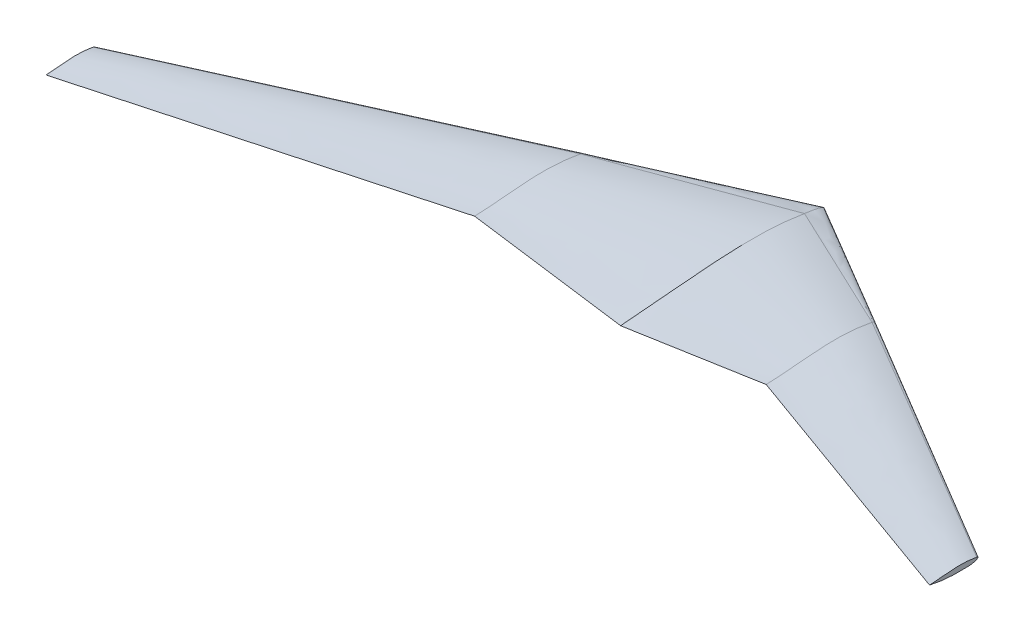
ISO-10303-21;
HEADER;
FILE_DESCRIPTION(('STEP AP214'),'2;1');
FILE_NAME('part.step','',(''),(''),'','','');
FILE_SCHEMA(('AUTOMOTIVE_DESIGN { 1 0 10303 214 1 1 1 1 }'));
ENDSEC;
DATA;
#1=APPLICATION_CONTEXT('core data for automotive mechanical design processes');
#2=APPLICATION_PROTOCOL_DEFINITION('international standard','automotive_design',2000,#1);
#3=PRODUCT_CONTEXT('',#1,'mechanical');
#4=PRODUCT('Part','Part','',(#3));
#5=PRODUCT_RELATED_PRODUCT_CATEGORY('part','',(#4));
#6=PRODUCT_DEFINITION_FORMATION('','',#4);
#7=PRODUCT_DEFINITION_CONTEXT('part definition',#1,'design');
#8=PRODUCT_DEFINITION('design','',#6,#7);
#9=PRODUCT_DEFINITION_SHAPE('','',#8);
#10=(LENGTH_UNIT() NAMED_UNIT(*) SI_UNIT(.MILLI.,.METRE.));
#11=(NAMED_UNIT(*) PLANE_ANGLE_UNIT() SI_UNIT($,.RADIAN.));
#12=(NAMED_UNIT(*) SI_UNIT($,.STERADIAN.) SOLID_ANGLE_UNIT());
#13=UNCERTAINTY_MEASURE_WITH_UNIT(LENGTH_MEASURE(1.E-05),#10,'distance_accuracy_value','');
#14=(GEOMETRIC_REPRESENTATION_CONTEXT(3) GLOBAL_UNCERTAINTY_ASSIGNED_CONTEXT((#13)) GLOBAL_UNIT_ASSIGNED_CONTEXT((#10,
#11,#12)) REPRESENTATION_CONTEXT('',''));
#15=CARTESIAN_POINT('',(0.,0.,0.));
#16=DIRECTION('',(0.,0.,1.));
#17=DIRECTION('',(1.,0.,0.));
#18=AXIS2_PLACEMENT_3D('',#15,#16,#17);
#19=CARTESIAN_POINT('',(0.,260.387336810801,-744.733559914351));
#20=CARTESIAN_POINT('',(-7292.34,1153.17328324079,3166.45384113986));
#21=CARTESIAN_POINT('',(0.,217.676560237623,-941.669375822272));
#22=CARTESIAN_POINT('',(-7292.34,1151.52912943844,3129.42071627404));
#23=CARTESIAN_POINT('',(0.,200.985498169548,-1201.06351893948));
#24=CARTESIAN_POINT('',(-7292.34,1139.46120575545,3087.83128190049));
#25=CARTESIAN_POINT('',(0.,135.060922071614,-1483.36610378253));
#26=CARTESIAN_POINT('',(-7292.34,1111.81578521799,3050.76264197452));
#27=CARTESIAN_POINT('',(0.,85.2767654545005,-1618.65012495777));
#28=CARTESIAN_POINT('',(-7292.34,1095.45851871228,3033.60396087625));
#29=CARTESIAN_POINT('',(0.,59.3682520834628,-1706.22020449412));
#30=CARTESIAN_POINT('',(-7292.34,1084.31703089921,3024.30886069101));
#31=CARTESIAN_POINT('',(0.,0.,-1731.48199233716));
#32=CARTESIAN_POINT('',(-7292.34,1076.1900662028,3018.47092959704));
#33=B_SPLINE_SURFACE_WITH_KNOTS('',3,1,((#19,#20),(#21,#22),(#23,#24),(#25,#26),(#27,#28),(#29,
#30),(#31,#32)),.UNSPECIFIED.,.F.,.F.,.F.,(4,1,1,1,4),(2,2),(0.,0.580238622590455,
0.750540673183221,0.832394192156572,1.),(0.,1.),.UNSPECIFIED.);
#34=CARTESIAN_POINT('',(0.,0.,-1731.48199233716));
#35=CARTESIAN_POINT('',(0.,59.3682520834628,-1706.22020449412));
#36=CARTESIAN_POINT('',(0.,85.2767654545005,-1618.65012495777));
#37=CARTESIAN_POINT('',(0.,135.060922071614,-1483.36610378253));
#38=CARTESIAN_POINT('',(0.,200.985498169548,-1201.06351893948));
#39=CARTESIAN_POINT('',(0.,217.676560237623,-941.669375822272));
#40=CARTESIAN_POINT('',(0.,260.387336810801,-744.733559914351));
#41=B_SPLINE_CURVE_WITH_KNOTS('',3,(#34,#35,#36,#37,#38,#39,#40),.UNSPECIFIED.,.F.,.F.,(4,1,1,1,
4),(0.,0.167605807843428,0.249459326816779,0.419761377409545,1.),.UNSPECIFIED.);
#42=CARTESIAN_POINT('',(0.,0.,-1731.48199233716));
#43=VERTEX_POINT('',#42);
#44=CARTESIAN_POINT('',(0.,260.387336810801,-744.733559914351));
#45=VERTEX_POINT('',#44);
#46=EDGE_CURVE('E136',#43,#45,#41,.T.);
#47=DIRECTION('',(-0.831587756276085,0.12272418489541,0.541664636148109));
#48=VECTOR('',#47,1.);
#49=CARTESIAN_POINT('',(-3646.17,538.095033101399,643.49446862994));
#50=LINE('',#49,#48);
#51=CARTESIAN_POINT('',(-7292.34,1076.1900662028,3018.47092959704));
#52=VERTEX_POINT('',#51);
#53=EDGE_CURVE('E404',#43,#52,#50,.T.);
#54=CARTESIAN_POINT('',(-7292.34,1076.1900662028,3018.47092959704));
#55=CARTESIAN_POINT('',(-7292.34,1148.92291001933,3070.71790572293));
#56=CARTESIAN_POINT('',(-7292.34,1153.17328324079,3166.45384113986));
#57=B_SPLINE_CURVE_WITH_KNOTS('',2,(#54,#55,#56),.UNSPECIFIED.,.F.,.F.,(3,3),(0.,1.),.UNSPECIFIED.);
#58=CARTESIAN_POINT('',(-7292.34,1153.17328324079,3166.45384113986));
#59=VERTEX_POINT('',#58);
#60=EDGE_CURVE('E12',#52,#59,#57,.T.);
#61=DIRECTION('',(0.876165050992659,-0.107267056154727,-0.469924017350604));
#62=VECTOR('',#61,1.);
#63=CARTESIAN_POINT('',(-3646.17,706.780310025795,1210.86014061275));
#64=LINE('',#63,#62);
#65=EDGE_CURVE('E361',#59,#45,#64,.T.);
#66=ORIENTED_EDGE('',*,*,#46,.F.);
#67=ORIENTED_EDGE('',*,*,#53,.T.);
#68=ORIENTED_EDGE('',*,*,#60,.T.);
#69=ORIENTED_EDGE('',*,*,#65,.T.);
#70=EDGE_LOOP('',(#66,#67,#68,#69));
#71=FACE_BOUND('',#70,.T.);
#72=ADVANCED_FACE('F107',(#71),#33,.T.);
#73=CARTESIAN_POINT('',(0.,0.,-1731.48199233716));
#74=CARTESIAN_POINT('',(-7292.34,1076.1900662028,3018.47092959704));
#75=CARTESIAN_POINT('',(0.,-118.734933461686,-1686.62498270225));
#76=CARTESIAN_POINT('',(-7292.34,1015.35737052522,3043.11370785958));
#77=CARTESIAN_POINT('',(0.,-236.972907199275,-1555.63619789665));
#78=CARTESIAN_POINT('',(-7292.34,955.276697450234,3122.37248310726));
#79=CARTESIAN_POINT('',(0.,-335.876819266343,-1349.99085497511));
#80=CARTESIAN_POINT('',(-7292.34,902.010557440944,3228.31234854547));
#81=CARTESIAN_POINT('',(0.,-469.570111960643,-1018.52456392987));
#82=CARTESIAN_POINT('',(-7292.34,832.095207762413,3401.66546839392));
#83=CARTESIAN_POINT('',(0.,-534.481345840856,-706.781055340202));
#84=CARTESIAN_POINT('',(-7292.34,796.628143439702,3570.28743860462));
#85=CARTESIAN_POINT('',(0.,-608.55645212864,-204.821333547278));
#86=CARTESIAN_POINT('',(-7292.34,757.703773263779,3840.22450337775));
#87=CARTESIAN_POINT('',(0.,-639.819677144706,126.949756489253));
#88=CARTESIAN_POINT('',(-7292.34,741.670424195974,4016.95491271545));
#89=CARTESIAN_POINT('',(0.,-674.201759282268,707.725221686085));
#90=CARTESIAN_POINT('',(-7292.34,724.164355584166,4326.4926402643));
#91=CARTESIAN_POINT('',(0.,-704.852858904594,1719.05710390087));
#92=CARTESIAN_POINT('',(-7292.34,711.225620174203,4867.09050785209));
#93=CARTESIAN_POINT('',(0.,-620.796740378935,4381.28859046797));
#94=CARTESIAN_POINT('',(-7292.34,728.428241013039,6290.67588617311));
#95=CARTESIAN_POINT('',(0.,-408.148490452978,6774.79444878944));
#96=CARTESIAN_POINT('',(-7292.34,884.90141922579,7561.36718461676));
#97=CARTESIAN_POINT('',(0.,0.,8454.54652640662));
#98=CARTESIAN_POINT('',(-7292.34,1103.03602541015,8461.91724150198));
#99=B_SPLINE_SURFACE_WITH_KNOTS('',3,1,((#73,#74),(#75,#76),(#77,#78),(#79,#80),(#81,#82),(#83,
#84),(#85,#86),(#87,#88),(#89,#90),(#91,#92),(#93,#94),(#95,#96),(#97,#98)),.UNSPECIFIED.,.F.,
.F.,.F.,(4,1,1,1,1,1,1,1,1,1,4),(2,2),(0.,0.0348359920457492,0.0508316330037527,
0.063802160185397,0.136254587096267,0.142864047268261,0.210368092571849,0.232210997366321,
0.310372825852521,0.50206229306496,1.),(0.,1.),.UNSPECIFIED.);
#100=CARTESIAN_POINT('',(0.,0.,8454.54652640662));
#101=CARTESIAN_POINT('',(0.,-408.148490452978,6774.79444878944));
#102=CARTESIAN_POINT('',(0.,-644.898134090907,4110.0104254071));
#103=CARTESIAN_POINT('',(0.,-719.990329527877,1115.38515346805));
#104=CARTESIAN_POINT('',(0.,-593.87329251628,-449.105010634986));
#105=CARTESIAN_POINT('',(0.,-422.477503460265,-1234.25075835153));
#106=CARTESIAN_POINT('',(0.,-173.254447713824,-1666.0279915321));
#107=CARTESIAN_POINT('',(0.,0.,-1731.48199233716));
#108=B_SPLINE_CURVE_WITH_KNOTS('',3,(#100,#101,#102,#103,#104,#105,#106,#107),.UNSPECIFIED.,.F.,
.F.,(4,1,1,1,1,4),(0.,0.49793770693504,0.767789002633679,0.863745412903733,0.949168366996247,
1.),.UNSPECIFIED.);
#109=CARTESIAN_POINT('',(0.,0.,8454.54652640662));
#110=VERTEX_POINT('',#109);
#111=EDGE_CURVE('E114',#110,#43,#108,.T.);
#112=DIRECTION('',(-0.98875241302255,0.149558239436873,0.000999379120590447));
#113=VECTOR('',#112,1.);
#114=CARTESIAN_POINT('',(-3646.17,551.518012705074,8458.2318839543));
#115=LINE('',#114,#113);
#116=CARTESIAN_POINT('',(-7292.34,1103.03602541015,8461.91724150198));
#117=VERTEX_POINT('',#116);
#118=EDGE_CURVE('E411',#110,#117,#115,.T.);
#119=CARTESIAN_POINT('',(-7292.34,1103.03602541015,8461.91724150198));
#120=CARTESIAN_POINT('',(-7292.34,800.926845985588,7214.68534430178));
#121=CARTESIAN_POINT('',(-7292.34,685.958224543505,5749.38689282503));
#122=CARTESIAN_POINT('',(-7292.34,728.610370403107,4160.91165207317));
#123=CARTESIAN_POINT('',(-7292.34,769.809843595114,3706.78321446926));
#124=CARTESIAN_POINT('',(-7292.34,833.326910748419,3383.50353559408));
#125=CARTESIAN_POINT('',(-7292.34,939.946125576748,3142.59666316966));
#126=CARTESIAN_POINT('',(-7292.34,1015.35737052522,3043.11370785958));
#127=CARTESIAN_POINT('',(-7292.34,1076.1900662028,3018.47092959704));
#128=B_SPLINE_CURVE_WITH_KNOTS('',3,(#119,#120,#121,#122,#123,#124,#125,#126,#127),
.UNSPECIFIED.,.F.,.F.,(4,1,1,1,1,1,4),(0.,0.689627174147479,0.789631907428151,0.857135952731739,
0.936197839814603,0.965164007954251,1.),.UNSPECIFIED.);
#129=EDGE_CURVE('E429',#117,#52,#128,.T.);
#130=ORIENTED_EDGE('',*,*,#111,.F.);
#131=ORIENTED_EDGE('',*,*,#118,.T.);
#132=ORIENTED_EDGE('',*,*,#129,.T.);
#133=ORIENTED_EDGE('',*,*,#53,.F.);
#134=EDGE_LOOP('',(#130,#131,#132,#133));
#135=FACE_BOUND('',#134,.T.);
#136=ADVANCED_FACE('F390',(#135),#99,.T.);
#137=CARTESIAN_POINT('',(0.,0.,8454.54652640662));
#138=CARTESIAN_POINT('',(-7292.34,1103.03602541015,8461.91724150198));
#139=CARTESIAN_POINT('',(0.,52.0116607205874,7986.02965874943));
#140=CARTESIAN_POINT('',(-7292.34,1106.2160517737,8190.0743997392));
#141=CARTESIAN_POINT('',(0.,104.378676807183,7251.09271957684));
#142=CARTESIAN_POINT('',(-7292.34,1135.72293184661,7766.9965020234));
#143=CARTESIAN_POINT('',(0.,180.727650224862,6366.61613966854));
#144=CARTESIAN_POINT('',(-7292.34,1184.43165672379,7257.67923420909));
#145=CARTESIAN_POINT('',(0.,246.305658070376,5634.80829071528));
#146=CARTESIAN_POINT('',(-7292.34,1222.1396863724,6836.29101021844));
#147=CARTESIAN_POINT('',(0.,340.394458818281,4588.53199488818));
#148=CARTESIAN_POINT('',(-7292.34,1272.44047288778,6234.5053099207));
#149=CARTESIAN_POINT('',(0.,504.442690874802,2402.5796955419));
#150=CARTESIAN_POINT('',(-7292.34,1368.394611091,4978.67603884609));
#151=CARTESIAN_POINT('',(0.,476.76315096298,535.093976324623));
#152=CARTESIAN_POINT('',(-7292.34,1297.41079665998,3895.10434425709));
#153=CARTESIAN_POINT('',(0.,260.387336810801,-744.733559914351));
#154=CARTESIAN_POINT('',(-7292.34,1153.17328324079,3166.45384113986));
#155=B_SPLINE_SURFACE_WITH_KNOTS('',3,1,((#137,#138),(#139,#140),(#141,#142),(#143,#144),(#145,
#146),(#147,#148),(#149,#150),(#151,#152),(#153,#154)),.UNSPECIFIED.,.F.,.F.,.F.,(4,1,1,1,1,1,
4),(2,2),(0.,0.153299517843718,0.239530426934965,0.288860937877881,0.392189576914114,
0.580539550394671,1.),(0.,1.),.UNSPECIFIED.);
#156=CARTESIAN_POINT('',(0.,260.387336810801,-744.733559914351));
#157=CARTESIAN_POINT('',(0.,627.223575333098,1425.04276740183));
#158=CARTESIAN_POINT('',(0.,388.883028171237,4039.08522405976));
#159=CARTESIAN_POINT('',(0.,115.163493137882,7099.73485166785));
#160=CARTESIAN_POINT('',(0.,52.0116607205874,7986.02965874943));
#161=CARTESIAN_POINT('',(0.,0.,8454.54652640662));
#162=B_SPLINE_CURVE_WITH_KNOTS('',3,(#156,#157,#158,#159,#160,#161),.UNSPECIFIED.,.F.,.F.,(4,1,
1,4),(0.,0.711139062122119,0.846700482156282,1.),.UNSPECIFIED.);
#163=EDGE_CURVE('E256',#45,#110,#162,.T.);
#164=CARTESIAN_POINT('',(-7292.34,1153.17328324079,3166.45384113986));
#165=CARTESIAN_POINT('',(-7292.34,1297.41079665998,3895.10434425709));
#166=CARTESIAN_POINT('',(-7292.34,1368.394611091,4978.67603884609));
#167=CARTESIAN_POINT('',(-7292.34,1265.78429701899,6321.62005709028));
#168=CARTESIAN_POINT('',(-7292.34,1178.91669152918,7345.99013740606));
#169=CARTESIAN_POINT('',(-7292.34,1108.00481515744,8037.16292483782));
#170=CARTESIAN_POINT('',(-7292.34,1103.03602541015,8461.91724150198));
#171=B_SPLINE_CURVE_WITH_KNOTS('',3,(#164,#165,#166,#167,#168,#169,#170),.UNSPECIFIED.,.F.,.F.,
(4,1,1,1,4),(0.,0.419460449605329,0.607810423085886,0.760469573065035,1.),.UNSPECIFIED.);
#172=EDGE_CURVE('E120',#59,#117,#171,.T.);
#173=ORIENTED_EDGE('',*,*,#163,.F.);
#174=ORIENTED_EDGE('',*,*,#65,.F.);
#175=ORIENTED_EDGE('',*,*,#172,.T.);
#176=ORIENTED_EDGE('',*,*,#118,.F.);
#177=EDGE_LOOP('',(#173,#174,#175,#176));
#178=FACE_BOUND('',#177,.T.);
#179=ADVANCED_FACE('F109',(#178),#155,.T.);
#180=CARTESIAN_POINT('',(-22098.,3152.75203834971,12701.3752483823));
#181=DIRECTION('',(1.,0.,0.));
#182=DIRECTION('',(0.,0.,-1.));
#183=AXIS2_PLACEMENT_3D('',#180,#181,#182);
#184=PLANE('',#183);
#185=CARTESIAN_POINT('',(-22098.,3135.58273621567,12673.1516045498));
#186=CARTESIAN_POINT('',(-22098.,3149.35904842616,12691.0004490937));
#187=CARTESIAN_POINT('',(-22098.,3158.47513906106,12710.7831296598));
#188=CARTESIAN_POINT('',(-22098.,3162.93100812038,12732.4996462479));
#189=B_SPLINE_CURVE_WITH_KNOTS('',3,(#185,#186,#187,#188),.UNSPECIFIED.,.F.,.F.,(4,4),(0.,1.),.UNSPECIFIED.);
#190=CARTESIAN_POINT('',(-22098.,3135.58273621567,12673.1516045498));
#191=VERTEX_POINT('',#190);
#192=CARTESIAN_POINT('',(-22098.,3162.93100812038,12732.4996462479));
#193=VERTEX_POINT('',#192);
#194=EDGE_CURVE('E318',#191,#193,#189,.T.);
#195=ORIENTED_EDGE('',*,*,#194,.F.);
#196=CARTESIAN_POINT('',(-22098.,3135.58273621567,15097.2263938218));
#197=CARTESIAN_POINT('',(-22098.,2991.95606043891,14516.450731421));
#198=CARTESIAN_POINT('',(-22098.,2959.92709023944,13834.6882080708));
#199=CARTESIAN_POINT('',(-22098.,2976.24192726181,13092.6448120371));
#200=CARTESIAN_POINT('',(-22098.,3010.01559556347,12887.8331858639));
#201=CARTESIAN_POINT('',(-22098.,3047.63384774062,12754.0011682962));
#202=CARTESIAN_POINT('',(-22098.,3105.6001597783,12685.3703953843));
#203=CARTESIAN_POINT('',(-22098.,3135.58273621567,12673.1516045498));
#204=B_SPLINE_CURVE_WITH_KNOTS('',3,(#196,#197,#198,#199,#200,#201,#202,#203),.UNSPECIFIED.,.F.,
.F.,(4,1,1,1,1,4),(0.,0.709613234566189,0.833325197958082,0.896747906541119,0.961199172991794,
1.),.UNSPECIFIED.);
#205=CARTESIAN_POINT('',(-22098.,3135.58273621567,15097.2263938218));
#206=VERTEX_POINT('',#205);
#207=EDGE_CURVE('E309',#206,#191,#204,.T.);
#208=ORIENTED_EDGE('',*,*,#207,.F.);
#209=CARTESIAN_POINT('',(-22098.,3162.93100812038,12732.4996462479));
#210=CARTESIAN_POINT('',(-22098.,3231.52415410385,13081.8056701897));
#211=CARTESIAN_POINT('',(-22098.,3278.99846180943,13877.1098038461));
#212=CARTESIAN_POINT('',(-22098.,3150.96175775808,14661.9579817076));
#213=CARTESIAN_POINT('',(-22098.,3135.58273621567,15097.2263938218));
#214=B_SPLINE_CURVE_WITH_KNOTS('',3,(#209,#210,#211,#212,#213),.UNSPECIFIED.,.F.,.F.,(4,1,4),
(0.,0.449340889742178,1.),.UNSPECIFIED.);
#215=EDGE_CURVE('E317',#193,#206,#214,.T.);
#216=ORIENTED_EDGE('',*,*,#215,.F.);
#217=EDGE_LOOP('',(#195,#208,#216));
#218=FACE_BOUND('',#217,.T.);
#219=ADVANCED_FACE('F279',(#218),#184,.F.);
#220=CARTESIAN_POINT('',(-7292.34,1153.17328324079,3166.45384113986));
#221=CARTESIAN_POINT('',(-22098.,3162.93100812038,12732.4996462479));
#222=CARTESIAN_POINT('',(-7292.34,1150.33970109315,3102.62988419524));
#223=CARTESIAN_POINT('',(-22098.,3158.47513906106,12710.7831296598));
#224=CARTESIAN_POINT('',(-7292.34,1124.67862874715,3053.3022470143));
#225=CARTESIAN_POINT('',(-22098.,3149.35904842616,12691.0004490937));
#226=CARTESIAN_POINT('',(-7292.34,1076.1900662028,3018.47092959704));
#227=CARTESIAN_POINT('',(-22098.,3135.58273621567,12673.1516045498));
#228=B_SPLINE_SURFACE_WITH_KNOTS('',3,1,((#220,#221),(#222,#223),(#224,#225),(#226,#227)),
.UNSPECIFIED.,.F.,.F.,.F.,(4,4),(2,2),(0.,1.),(0.,1.),.UNSPECIFIED.);
#229=DIRECTION('',(-0.832013019701396,0.11572881682602,0.542550620682912));
#230=VECTOR('',#229,1.);
#231=CARTESIAN_POINT('',(-14695.17,2105.88640120923,7845.81126707343));
#232=LINE('',#231,#230);
#233=EDGE_CURVE('E128',#52,#191,#232,.T.);
#234=DIRECTION('',(0.834527810172284,-0.113280915077112,-0.539194555173126));
#235=VECTOR('',#234,1.);
#236=CARTESIAN_POINT('',(-14695.17,2158.05214568059,7949.47674369385));
#237=LINE('',#236,#235);
#238=EDGE_CURVE('E337',#193,#59,#237,.T.);
#239=ORIENTED_EDGE('',*,*,#60,.F.);
#240=ORIENTED_EDGE('',*,*,#233,.T.);
#241=ORIENTED_EDGE('',*,*,#194,.T.);
#242=ORIENTED_EDGE('',*,*,#238,.T.);
#243=EDGE_LOOP('',(#239,#240,#241,#242));
#244=FACE_BOUND('',#243,.T.);
#245=ADVANCED_FACE('F288',(#244),#228,.T.);
#246=CARTESIAN_POINT('',(-7292.34,1076.1900662028,3018.47092959704));
#247=CARTESIAN_POINT('',(-22098.,3135.58273621567,12673.1516045498));
#248=CARTESIAN_POINT('',(-7292.34,1015.35737052522,3043.11370785958));
#249=CARTESIAN_POINT('',(-22098.,3108.6639080664,12684.1218269172));
#250=CARTESIAN_POINT('',(-7292.34,969.496561718488,3103.61355501264));
#251=CARTESIAN_POINT('',(-22098.,3086.04303587485,12708.5255778039));
#252=CARTESIAN_POINT('',(-7292.34,910.989129121673,3208.02520212514));
#253=CARTESIAN_POINT('',(-22098.,3057.45059616406,12753.9105493142));
#254=CARTESIAN_POINT('',(-7292.34,860.895639020727,3323.7833144045));
#255=CARTESIAN_POINT('',(-22098.,3033.23379613175,12805.231298575));
#256=CARTESIAN_POINT('',(-7292.34,808.57024176992,3509.50633068648));
#257=CARTESIAN_POINT('',(-22098.,3011.60763261643,12889.0155997062));
#258=CARTESIAN_POINT('',(-7292.34,776.738228264029,3698.96998239751));
#259=CARTESIAN_POINT('',(-22098.,2996.04582958426,12972.5491978146));
#260=CARTESIAN_POINT('',(-7292.34,752.620861933847,3896.25178727004));
#261=CARTESIAN_POINT('',(-22098.,2984.29754992823,13060.0542654326));
#262=CARTESIAN_POINT('',(-7292.34,730.431662736411,4168.1961622586));
#263=CARTESIAN_POINT('',(-22098.,2974.29312977339,13181.2814502401));
#264=CARTESIAN_POINT('',(-7292.34,721.26945736271,4434.30607043534));
#265=CARTESIAN_POINT('',(-22098.,2972.10544708893,13300.1185615708));
#266=CARTESIAN_POINT('',(-7292.34,697.608762499257,5897.87536743056));
#267=CARTESIAN_POINT('',(-22098.,2965.4501438248,13952.2508685467));
#268=CARTESIAN_POINT('',(-7292.34,800.926845985588,7214.68534430178));
#269=CARTESIAN_POINT('',(-22098.,2996.00126602413,14532.808117266));
#270=CARTESIAN_POINT('',(-7292.34,1103.03602541015,8461.91724150198));
#271=CARTESIAN_POINT('',(-22098.,3135.58273621567,15097.2263938218));
#272=B_SPLINE_SURFACE_WITH_KNOTS('',3,1,((#246,#247),(#248,#249),(#250,#251),(#252,#253),(#254,
#255),(#256,#257),(#258,#259),(#260,#261),(#262,#263),(#264,#265),(#266,#267),(#268,#269),(#270,
#271)),.UNSPECIFIED.,.F.,.F.,.F.,(4,1,1,1,1,1,1,1,1,1,4),(2,2),(0.,0.0348359920457492,
0.0388008270082061,0.063802160185397,0.103252093458881,0.142864047268261,0.166674802041918,
0.210368092571849,0.290386765433811,0.310372825852521,1.),(0.,1.),.UNSPECIFIED.);
#273=DIRECTION('',(-0.905471045842005,0.124304637277622,0.405796183191839));
#274=VECTOR('',#273,1.);
#275=CARTESIAN_POINT('',(-14695.17,2119.30938081291,11779.5718176619));
#276=LINE('',#275,#274);
#277=EDGE_CURVE('E348',#117,#206,#276,.T.);
#278=ORIENTED_EDGE('',*,*,#129,.F.);
#279=ORIENTED_EDGE('',*,*,#277,.T.);
#280=ORIENTED_EDGE('',*,*,#207,.T.);
#281=ORIENTED_EDGE('',*,*,#233,.F.);
#282=EDGE_LOOP('',(#278,#279,#280,#281));
#283=FACE_BOUND('',#282,.T.);
#284=ADVANCED_FACE('F377',(#283),#272,.T.);
#285=CARTESIAN_POINT('',(-7292.34,1103.03602541015,8461.91724150198));
#286=CARTESIAN_POINT('',(-22098.,3135.58273621567,15097.2263938218));
#287=CARTESIAN_POINT('',(-7292.34,1108.00481515744,8037.16292483782));
#288=CARTESIAN_POINT('',(-22098.,3142.27243502801,14907.8896033414));
#289=CARTESIAN_POINT('',(-7292.34,1178.91669152918,7345.99013740606));
#290=CARTESIAN_POINT('',(-22098.,3170.30393519823,14598.8390446932));
#291=CARTESIAN_POINT('',(-7292.34,1261.31321096825,6374.34450771909));
#292=CARTESIAN_POINT('',(-22098.,3215.35736586706,14165.1714413031));
#293=CARTESIAN_POINT('',(-7292.34,1307.76495350193,5772.18531443702));
#294=CARTESIAN_POINT('',(-22098.,3235.54616808515,13896.132670253));
#295=CARTESIAN_POINT('',(-7292.34,1349.88757086828,4696.16508762848));
#296=CARTESIAN_POINT('',(-22098.,3251.43774855873,13415.4042996662));
#297=CARTESIAN_POINT('',(-7292.34,1297.41079665998,3895.10434425709));
#298=CARTESIAN_POINT('',(-22098.,3226.96282118457,13058.5773863275));
#299=CARTESIAN_POINT('',(-7292.34,1153.17328324079,3166.45384113986));
#300=CARTESIAN_POINT('',(-22098.,3162.93100812038,12732.4996462479));
#301=B_SPLINE_SURFACE_WITH_KNOTS('',3,1,((#285,#286),(#287,#288),(#289,#290),(#291,#292),(#293,
#294),(#295,#296),(#297,#298),(#299,#300)),.UNSPECIFIED.,.F.,.F.,.F.,(4,1,1,1,1,4),(2,2),(0.,
0.239530426934965,0.392189576914114,0.550659110257822,0.580539550394671,1.),(0.,1.),.UNSPECIFIED.);
#302=ORIENTED_EDGE('',*,*,#172,.F.);
#303=ORIENTED_EDGE('',*,*,#238,.F.);
#304=ORIENTED_EDGE('',*,*,#215,.T.);
#305=ORIENTED_EDGE('',*,*,#277,.F.);
#306=EDGE_LOOP('',(#302,#303,#304,#305));
#307=FACE_BOUND('',#306,.T.);
#308=ADVANCED_FACE('F345',(#307),#301,.T.);
#309=CARTESIAN_POINT('',(0.,260.387336810801,-744.733559914351));
#310=CARTESIAN_POINT('',(7292.34,1153.17328324079,3166.45384113986));
#311=CARTESIAN_POINT('',(0.,217.676560237623,-941.669375822272));
#312=CARTESIAN_POINT('',(7292.34,1151.52912943844,3129.42071627404));
#313=CARTESIAN_POINT('',(0.,200.985498169548,-1201.06351893948));
#314=CARTESIAN_POINT('',(7292.34,1139.46120575545,3087.83128190049));
#315=CARTESIAN_POINT('',(0.,135.060922071614,-1483.36610378253));
#316=CARTESIAN_POINT('',(7292.34,1111.81578521799,3050.76264197452));
#317=CARTESIAN_POINT('',(0.,85.2767654545005,-1618.65012495777));
#318=CARTESIAN_POINT('',(7292.34,1095.45851871228,3033.60396087625));
#319=CARTESIAN_POINT('',(0.,59.3682520834628,-1706.22020449412));
#320=CARTESIAN_POINT('',(7292.34,1084.31703089921,3024.30886069101));
#321=CARTESIAN_POINT('',(0.,0.,-1731.48199233716));
#322=CARTESIAN_POINT('',(7292.34,1076.1900662028,3018.47092959704));
#323=B_SPLINE_SURFACE_WITH_KNOTS('',3,1,((#309,#310),(#311,#312),(#313,#314),(#315,#316),(#317,
#318),(#319,#320),(#321,#322)),.UNSPECIFIED.,.F.,.F.,.F.,(4,1,1,1,4),(2,2),(0.,
0.580238622590455,0.750540673183221,0.832394192156572,1.),(0.,1.),.UNSPECIFIED.);
#324=DIRECTION('',(-0.876165050992659,-0.107267056154727,-0.469924017350604));
#325=VECTOR('',#324,1.);
#326=CARTESIAN_POINT('',(3646.17,706.780310025795,1210.86014061275));
#327=LINE('',#326,#325);
#328=CARTESIAN_POINT('',(7292.34,1153.17328324079,3166.45384113986));
#329=VERTEX_POINT('',#328);
#330=EDGE_CURVE('E454',#329,#45,#327,.T.);
#331=CARTESIAN_POINT('',(7292.34,1076.1900662028,3018.47092959704));
#332=CARTESIAN_POINT('',(7292.34,1148.92291001933,3070.71790572293));
#333=CARTESIAN_POINT('',(7292.34,1153.17328324079,3166.45384113986));
#334=B_SPLINE_CURVE_WITH_KNOTS('',2,(#331,#332,#333),.UNSPECIFIED.,.F.,.F.,(3,3),(0.,1.),.UNSPECIFIED.);
#335=CARTESIAN_POINT('',(7292.34,1076.1900662028,3018.47092959704));
#336=VERTEX_POINT('',#335);
#337=EDGE_CURVE('E342',#336,#329,#334,.T.);
#338=DIRECTION('',(0.831587756276085,0.12272418489541,0.541664636148109));
#339=VECTOR('',#338,1.);
#340=CARTESIAN_POINT('',(3646.17,538.095033101399,643.49446862994));
#341=LINE('',#340,#339);
#342=EDGE_CURVE('E498',#43,#336,#341,.T.);
#343=ORIENTED_EDGE('',*,*,#46,.T.);
#344=ORIENTED_EDGE('',*,*,#330,.F.);
#345=ORIENTED_EDGE('',*,*,#337,.F.);
#346=ORIENTED_EDGE('',*,*,#342,.F.);
#347=EDGE_LOOP('',(#343,#344,#345,#346));
#348=FACE_BOUND('',#347,.T.);
#349=ADVANCED_FACE('F376',(#348),#323,.F.);
#350=CARTESIAN_POINT('',(0.,0.,-1731.48199233716));
#351=CARTESIAN_POINT('',(7292.34,1076.1900662028,3018.47092959704));
#352=CARTESIAN_POINT('',(0.,-118.734933461686,-1686.62498270225));
#353=CARTESIAN_POINT('',(7292.34,1015.35737052522,3043.11370785958));
#354=CARTESIAN_POINT('',(0.,-236.972907199275,-1555.63619789665));
#355=CARTESIAN_POINT('',(7292.34,955.276697450234,3122.37248310726));
#356=CARTESIAN_POINT('',(0.,-335.876819266343,-1349.99085497511));
#357=CARTESIAN_POINT('',(7292.34,902.010557440944,3228.31234854547));
#358=CARTESIAN_POINT('',(0.,-469.570111960643,-1018.52456392987));
#359=CARTESIAN_POINT('',(7292.34,832.095207762413,3401.66546839392));
#360=CARTESIAN_POINT('',(0.,-534.481345840856,-706.781055340202));
#361=CARTESIAN_POINT('',(7292.34,796.628143439702,3570.28743860462));
#362=CARTESIAN_POINT('',(0.,-608.55645212864,-204.821333547278));
#363=CARTESIAN_POINT('',(7292.34,757.703773263779,3840.22450337775));
#364=CARTESIAN_POINT('',(0.,-639.819677144706,126.949756489253));
#365=CARTESIAN_POINT('',(7292.34,741.670424195974,4016.95491271545));
#366=CARTESIAN_POINT('',(0.,-674.201759282268,707.725221686085));
#367=CARTESIAN_POINT('',(7292.34,724.164355584166,4326.4926402643));
#368=CARTESIAN_POINT('',(0.,-704.852858904594,1719.05710390087));
#369=CARTESIAN_POINT('',(7292.34,711.225620174203,4867.09050785209));
#370=CARTESIAN_POINT('',(0.,-620.796740378935,4381.28859046797));
#371=CARTESIAN_POINT('',(7292.34,728.428241013039,6290.67588617311));
#372=CARTESIAN_POINT('',(0.,-408.148490452978,6774.79444878944));
#373=CARTESIAN_POINT('',(7292.34,884.90141922579,7561.36718461676));
#374=CARTESIAN_POINT('',(0.,0.,8454.54652640662));
#375=CARTESIAN_POINT('',(7292.34,1103.03602541015,8461.91724150198));
#376=B_SPLINE_SURFACE_WITH_KNOTS('',3,1,((#350,#351),(#352,#353),(#354,#355),(#356,#357),(#358,
#359),(#360,#361),(#362,#363),(#364,#365),(#366,#367),(#368,#369),(#370,#371),(#372,#373),(#374,
#375)),.UNSPECIFIED.,.F.,.F.,.F.,(4,1,1,1,1,1,1,1,1,1,4),(2,2),(0.,0.0348359920457492,
0.0508316330037527,0.063802160185397,0.136254587096267,0.142864047268261,0.210368092571849,
0.232210997366321,0.310372825852521,0.50206229306496,1.),(0.,1.),.UNSPECIFIED.);
#377=CARTESIAN_POINT('',(7292.34,1103.03602541015,8461.91724150198));
#378=CARTESIAN_POINT('',(7292.34,800.926845985588,7214.68534430178));
#379=CARTESIAN_POINT('',(7292.34,685.958224543505,5749.38689282503));
#380=CARTESIAN_POINT('',(7292.34,728.610370403107,4160.91165207317));
#381=CARTESIAN_POINT('',(7292.34,769.809843595114,3706.78321446926));
#382=CARTESIAN_POINT('',(7292.34,833.326910748419,3383.50353559408));
#383=CARTESIAN_POINT('',(7292.34,939.946125576748,3142.59666316966));
#384=CARTESIAN_POINT('',(7292.34,1015.35737052522,3043.11370785958));
#385=CARTESIAN_POINT('',(7292.34,1076.1900662028,3018.47092959704));
#386=B_SPLINE_CURVE_WITH_KNOTS('',3,(#377,#378,#379,#380,#381,#382,#383,#384,#385),
.UNSPECIFIED.,.F.,.F.,(4,1,1,1,1,1,4),(0.,0.689627174147479,0.789631907428151,0.857135952731739,
0.936197839814603,0.965164007954251,1.),.UNSPECIFIED.);
#387=CARTESIAN_POINT('',(7292.34,1103.03602541015,8461.91724150198));
#388=VERTEX_POINT('',#387);
#389=EDGE_CURVE('E480',#388,#336,#386,.T.);
#390=DIRECTION('',(0.98875241302255,0.149558239436873,0.000999379120590447));
#391=VECTOR('',#390,1.);
#392=CARTESIAN_POINT('',(3646.17,551.518012705074,8458.2318839543));
#393=LINE('',#392,#391);
#394=EDGE_CURVE('E261',#110,#388,#393,.T.);
#395=ORIENTED_EDGE('',*,*,#111,.T.);
#396=ORIENTED_EDGE('',*,*,#342,.T.);
#397=ORIENTED_EDGE('',*,*,#389,.F.);
#398=ORIENTED_EDGE('',*,*,#394,.F.);
#399=EDGE_LOOP('',(#395,#396,#397,#398));
#400=FACE_BOUND('',#399,.T.);
#401=ADVANCED_FACE('F274',(#400),#376,.F.);
#402=CARTESIAN_POINT('',(0.,0.,8454.54652640662));
#403=CARTESIAN_POINT('',(7292.34,1103.03602541015,8461.91724150198));
#404=CARTESIAN_POINT('',(0.,52.0116607205874,7986.02965874943));
#405=CARTESIAN_POINT('',(7292.34,1106.2160517737,8190.0743997392));
#406=CARTESIAN_POINT('',(0.,104.378676807183,7251.09271957684));
#407=CARTESIAN_POINT('',(7292.34,1135.72293184661,7766.9965020234));
#408=CARTESIAN_POINT('',(0.,180.727650224862,6366.61613966854));
#409=CARTESIAN_POINT('',(7292.34,1184.43165672379,7257.67923420909));
#410=CARTESIAN_POINT('',(0.,246.305658070376,5634.80829071528));
#411=CARTESIAN_POINT('',(7292.34,1222.1396863724,6836.29101021844));
#412=CARTESIAN_POINT('',(0.,340.394458818281,4588.53199488818));
#413=CARTESIAN_POINT('',(7292.34,1272.44047288778,6234.5053099207));
#414=CARTESIAN_POINT('',(0.,504.442690874802,2402.5796955419));
#415=CARTESIAN_POINT('',(7292.34,1368.394611091,4978.67603884609));
#416=CARTESIAN_POINT('',(0.,476.76315096298,535.093976324623));
#417=CARTESIAN_POINT('',(7292.34,1297.41079665998,3895.10434425709));
#418=CARTESIAN_POINT('',(0.,260.387336810801,-744.733559914351));
#419=CARTESIAN_POINT('',(7292.34,1153.17328324079,3166.45384113986));
#420=B_SPLINE_SURFACE_WITH_KNOTS('',3,1,((#402,#403),(#404,#405),(#406,#407),(#408,#409),(#410,
#411),(#412,#413),(#414,#415),(#416,#417),(#418,#419)),.UNSPECIFIED.,.F.,.F.,.F.,(4,1,1,1,1,1,
4),(2,2),(0.,0.153299517843718,0.239530426934965,0.288860937877881,0.392189576914114,
0.580539550394671,1.),(0.,1.),.UNSPECIFIED.);
#421=CARTESIAN_POINT('',(7292.34,1153.17328324079,3166.45384113986));
#422=CARTESIAN_POINT('',(7292.34,1297.41079665998,3895.10434425709));
#423=CARTESIAN_POINT('',(7292.34,1368.394611091,4978.67603884609));
#424=CARTESIAN_POINT('',(7292.34,1265.78429701899,6321.62005709028));
#425=CARTESIAN_POINT('',(7292.34,1178.91669152918,7345.99013740606));
#426=CARTESIAN_POINT('',(7292.34,1108.00481515744,8037.16292483782));
#427=CARTESIAN_POINT('',(7292.34,1103.03602541015,8461.91724150198));
#428=B_SPLINE_CURVE_WITH_KNOTS('',3,(#421,#422,#423,#424,#425,#426,#427),.UNSPECIFIED.,.F.,.F.,
(4,1,1,1,4),(0.,0.419460449605329,0.607810423085886,0.760469573065035,1.),.UNSPECIFIED.);
#429=EDGE_CURVE('E185',#329,#388,#428,.T.);
#430=ORIENTED_EDGE('',*,*,#163,.T.);
#431=ORIENTED_EDGE('',*,*,#394,.T.);
#432=ORIENTED_EDGE('',*,*,#429,.F.);
#433=ORIENTED_EDGE('',*,*,#330,.T.);
#434=EDGE_LOOP('',(#430,#431,#432,#433));
#435=FACE_BOUND('',#434,.T.);
#436=ADVANCED_FACE('F227',(#435),#420,.F.);
#437=CARTESIAN_POINT('',(22098.,3152.75203834971,12701.3752483823));
#438=DIRECTION('',(-1.,0.,0.));
#439=DIRECTION('',(0.,0.,-1.));
#440=AXIS2_PLACEMENT_3D('',#437,#438,#439);
#441=PLANE('',#440);
#442=CARTESIAN_POINT('',(22098.,3135.58273621567,12673.1516045498));
#443=CARTESIAN_POINT('',(22098.,3149.35904842616,12691.0004490937));
#444=CARTESIAN_POINT('',(22098.,3158.47513906106,12710.7831296598));
#445=CARTESIAN_POINT('',(22098.,3162.93100812038,12732.4996462479));
#446=B_SPLINE_CURVE_WITH_KNOTS('',3,(#442,#443,#444,#445),.UNSPECIFIED.,.F.,.F.,(4,4),(0.,1.),.UNSPECIFIED.);
#447=CARTESIAN_POINT('',(22098.,3135.58273621567,12673.1516045498));
#448=VERTEX_POINT('',#447);
#449=CARTESIAN_POINT('',(22098.,3162.93100812038,12732.4996462479));
#450=VERTEX_POINT('',#449);
#451=EDGE_CURVE('E198',#448,#450,#446,.T.);
#452=ORIENTED_EDGE('',*,*,#451,.T.);
#453=CARTESIAN_POINT('',(22098.,3162.93100812038,12732.4996462479));
#454=CARTESIAN_POINT('',(22098.,3231.52415410385,13081.8056701897));
#455=CARTESIAN_POINT('',(22098.,3278.99846180943,13877.1098038461));
#456=CARTESIAN_POINT('',(22098.,3150.96175775808,14661.9579817076));
#457=CARTESIAN_POINT('',(22098.,3135.58273621567,15097.2263938218));
#458=B_SPLINE_CURVE_WITH_KNOTS('',3,(#453,#454,#455,#456,#457),.UNSPECIFIED.,.F.,.F.,(4,1,4),
(0.,0.449340889742178,1.),.UNSPECIFIED.);
#459=CARTESIAN_POINT('',(22098.,3135.58273621567,15097.2263938218));
#460=VERTEX_POINT('',#459);
#461=EDGE_CURVE('E181',#450,#460,#458,.T.);
#462=ORIENTED_EDGE('',*,*,#461,.T.);
#463=CARTESIAN_POINT('',(22098.,3135.58273621567,15097.2263938218));
#464=CARTESIAN_POINT('',(22098.,2991.95606043891,14516.450731421));
#465=CARTESIAN_POINT('',(22098.,2959.92709023944,13834.6882080708));
#466=CARTESIAN_POINT('',(22098.,2976.24192726181,13092.6448120371));
#467=CARTESIAN_POINT('',(22098.,3010.01559556347,12887.8331858639));
#468=CARTESIAN_POINT('',(22098.,3047.63384774062,12754.0011682962));
#469=CARTESIAN_POINT('',(22098.,3105.6001597783,12685.3703953843));
#470=CARTESIAN_POINT('',(22098.,3135.58273621567,12673.1516045498));
#471=B_SPLINE_CURVE_WITH_KNOTS('',3,(#463,#464,#465,#466,#467,#468,#469,#470),.UNSPECIFIED.,.F.,
.F.,(4,1,1,1,1,4),(0.,0.709613234566189,0.833325197958082,0.896747906541119,0.961199172991794,
1.),.UNSPECIFIED.);
#472=EDGE_CURVE('E192',#460,#448,#471,.T.);
#473=ORIENTED_EDGE('',*,*,#472,.T.);
#474=EDGE_LOOP('',(#452,#462,#473));
#475=FACE_BOUND('',#474,.T.);
#476=ADVANCED_FACE('F203',(#475),#441,.F.);
#477=CARTESIAN_POINT('',(7292.34,1153.17328324079,3166.45384113986));
#478=CARTESIAN_POINT('',(22098.,3162.93100812038,12732.4996462479));
#479=CARTESIAN_POINT('',(7292.34,1150.33970109315,3102.62988419524));
#480=CARTESIAN_POINT('',(22098.,3158.47513906106,12710.7831296598));
#481=CARTESIAN_POINT('',(7292.34,1124.67862874715,3053.3022470143));
#482=CARTESIAN_POINT('',(22098.,3149.35904842616,12691.0004490937));
#483=CARTESIAN_POINT('',(7292.34,1076.1900662028,3018.47092959704));
#484=CARTESIAN_POINT('',(22098.,3135.58273621567,12673.1516045498));
#485=B_SPLINE_SURFACE_WITH_KNOTS('',3,1,((#477,#478),(#479,#480),(#481,#482),(#483,#484)),
.UNSPECIFIED.,.F.,.F.,.F.,(4,4),(2,2),(0.,1.),(0.,1.),.UNSPECIFIED.);
#486=DIRECTION('',(-0.834527810172284,-0.113280915077112,-0.539194555173126));
#487=VECTOR('',#486,1.);
#488=CARTESIAN_POINT('',(14695.17,2158.05214568059,7949.47674369385));
#489=LINE('',#488,#487);
#490=EDGE_CURVE('E205',#450,#329,#489,.T.);
#491=DIRECTION('',(0.832013019701396,0.11572881682602,0.542550620682912));
#492=VECTOR('',#491,1.);
#493=CARTESIAN_POINT('',(14695.17,2105.88640120923,7845.81126707343));
#494=LINE('',#493,#492);
#495=EDGE_CURVE('E189',#336,#448,#494,.T.);
#496=ORIENTED_EDGE('',*,*,#337,.T.);
#497=ORIENTED_EDGE('',*,*,#490,.F.);
#498=ORIENTED_EDGE('',*,*,#451,.F.);
#499=ORIENTED_EDGE('',*,*,#495,.F.);
#500=EDGE_LOOP('',(#496,#497,#498,#499));
#501=FACE_BOUND('',#500,.T.);
#502=ADVANCED_FACE('F226',(#501),#485,.F.);
#503=CARTESIAN_POINT('',(7292.34,1076.1900662028,3018.47092959704));
#504=CARTESIAN_POINT('',(22098.,3135.58273621567,12673.1516045498));
#505=CARTESIAN_POINT('',(7292.34,1015.35737052522,3043.11370785958));
#506=CARTESIAN_POINT('',(22098.,3108.6639080664,12684.1218269172));
#507=CARTESIAN_POINT('',(7292.34,969.496561718488,3103.61355501264));
#508=CARTESIAN_POINT('',(22098.,3086.04303587485,12708.5255778039));
#509=CARTESIAN_POINT('',(7292.34,910.989129121673,3208.02520212514));
#510=CARTESIAN_POINT('',(22098.,3057.45059616406,12753.9105493142));
#511=CARTESIAN_POINT('',(7292.34,860.895639020727,3323.7833144045));
#512=CARTESIAN_POINT('',(22098.,3033.23379613175,12805.231298575));
#513=CARTESIAN_POINT('',(7292.34,808.57024176992,3509.50633068648));
#514=CARTESIAN_POINT('',(22098.,3011.60763261643,12889.0155997062));
#515=CARTESIAN_POINT('',(7292.34,776.738228264029,3698.96998239751));
#516=CARTESIAN_POINT('',(22098.,2996.04582958426,12972.5491978146));
#517=CARTESIAN_POINT('',(7292.34,752.620861933847,3896.25178727004));
#518=CARTESIAN_POINT('',(22098.,2984.29754992823,13060.0542654326));
#519=CARTESIAN_POINT('',(7292.34,730.431662736411,4168.1961622586));
#520=CARTESIAN_POINT('',(22098.,2974.29312977339,13181.2814502401));
#521=CARTESIAN_POINT('',(7292.34,721.26945736271,4434.30607043534));
#522=CARTESIAN_POINT('',(22098.,2972.10544708893,13300.1185615708));
#523=CARTESIAN_POINT('',(7292.34,697.608762499257,5897.87536743056));
#524=CARTESIAN_POINT('',(22098.,2965.4501438248,13952.2508685467));
#525=CARTESIAN_POINT('',(7292.34,800.926845985588,7214.68534430178));
#526=CARTESIAN_POINT('',(22098.,2996.00126602413,14532.808117266));
#527=CARTESIAN_POINT('',(7292.34,1103.03602541015,8461.91724150198));
#528=CARTESIAN_POINT('',(22098.,3135.58273621567,15097.2263938218));
#529=B_SPLINE_SURFACE_WITH_KNOTS('',3,1,((#503,#504),(#505,#506),(#507,#508),(#509,#510),(#511,
#512),(#513,#514),(#515,#516),(#517,#518),(#519,#520),(#521,#522),(#523,#524),(#525,#526),(#527,
#528)),.UNSPECIFIED.,.F.,.F.,.F.,(4,1,1,1,1,1,1,1,1,1,4),(2,2),(0.,0.0348359920457492,
0.0388008270082061,0.063802160185397,0.103252093458881,0.142864047268261,0.166674802041918,
0.210368092571849,0.290386765433811,0.310372825852521,1.),(0.,1.),.UNSPECIFIED.);
#530=DIRECTION('',(0.905471045842005,0.124304637277622,0.405796183191839));
#531=VECTOR('',#530,1.);
#532=CARTESIAN_POINT('',(14695.17,2119.30938081291,11779.5718176619));
#533=LINE('',#532,#531);
#534=EDGE_CURVE('E177',#388,#460,#533,.T.);
#535=ORIENTED_EDGE('',*,*,#389,.T.);
#536=ORIENTED_EDGE('',*,*,#495,.T.);
#537=ORIENTED_EDGE('',*,*,#472,.F.);
#538=ORIENTED_EDGE('',*,*,#534,.F.);
#539=EDGE_LOOP('',(#535,#536,#537,#538));
#540=FACE_BOUND('',#539,.T.);
#541=ADVANCED_FACE('F194',(#540),#529,.F.);
#542=CARTESIAN_POINT('',(7292.34,1103.03602541015,8461.91724150198));
#543=CARTESIAN_POINT('',(22098.,3135.58273621567,15097.2263938218));
#544=CARTESIAN_POINT('',(7292.34,1108.00481515744,8037.16292483782));
#545=CARTESIAN_POINT('',(22098.,3142.27243502801,14907.8896033414));
#546=CARTESIAN_POINT('',(7292.34,1178.91669152918,7345.99013740606));
#547=CARTESIAN_POINT('',(22098.,3170.30393519823,14598.8390446932));
#548=CARTESIAN_POINT('',(7292.34,1261.31321096825,6374.34450771909));
#549=CARTESIAN_POINT('',(22098.,3215.35736586706,14165.1714413031));
#550=CARTESIAN_POINT('',(7292.34,1307.76495350193,5772.18531443702));
#551=CARTESIAN_POINT('',(22098.,3235.54616808515,13896.132670253));
#552=CARTESIAN_POINT('',(7292.34,1349.88757086828,4696.16508762848));
#553=CARTESIAN_POINT('',(22098.,3251.43774855873,13415.4042996662));
#554=CARTESIAN_POINT('',(7292.34,1297.41079665998,3895.10434425709));
#555=CARTESIAN_POINT('',(22098.,3226.96282118457,13058.5773863275));
#556=CARTESIAN_POINT('',(7292.34,1153.17328324079,3166.45384113986));
#557=CARTESIAN_POINT('',(22098.,3162.93100812038,12732.4996462479));
#558=B_SPLINE_SURFACE_WITH_KNOTS('',3,1,((#542,#543),(#544,#545),(#546,#547),(#548,#549),(#550,
#551),(#552,#553),(#554,#555),(#556,#557)),.UNSPECIFIED.,.F.,.F.,.F.,(4,1,1,1,1,4),(2,2),(0.,
0.239530426934965,0.392189576914114,0.550659110257822,0.580539550394671,1.),(0.,1.),.UNSPECIFIED.);
#559=ORIENTED_EDGE('',*,*,#429,.T.);
#560=ORIENTED_EDGE('',*,*,#534,.T.);
#561=ORIENTED_EDGE('',*,*,#461,.F.);
#562=ORIENTED_EDGE('',*,*,#490,.T.);
#563=EDGE_LOOP('',(#559,#560,#561,#562));
#564=FACE_BOUND('',#563,.T.);
#565=ADVANCED_FACE('F179',(#564),#558,.F.);
#566=CLOSED_SHELL('',(#72,#136,#179,#219,#245,#284,#308,#349,#401,#436,#476,#502,#541,#565));
#567=MANIFOLD_SOLID_BREP('B2',#566);
#568=ADVANCED_BREP_SHAPE_REPRESENTATION('',(#18,#567),#14);
#569=SHAPE_DEFINITION_REPRESENTATION(#9,#568);
ENDSEC;
END-ISO-10303-21;
